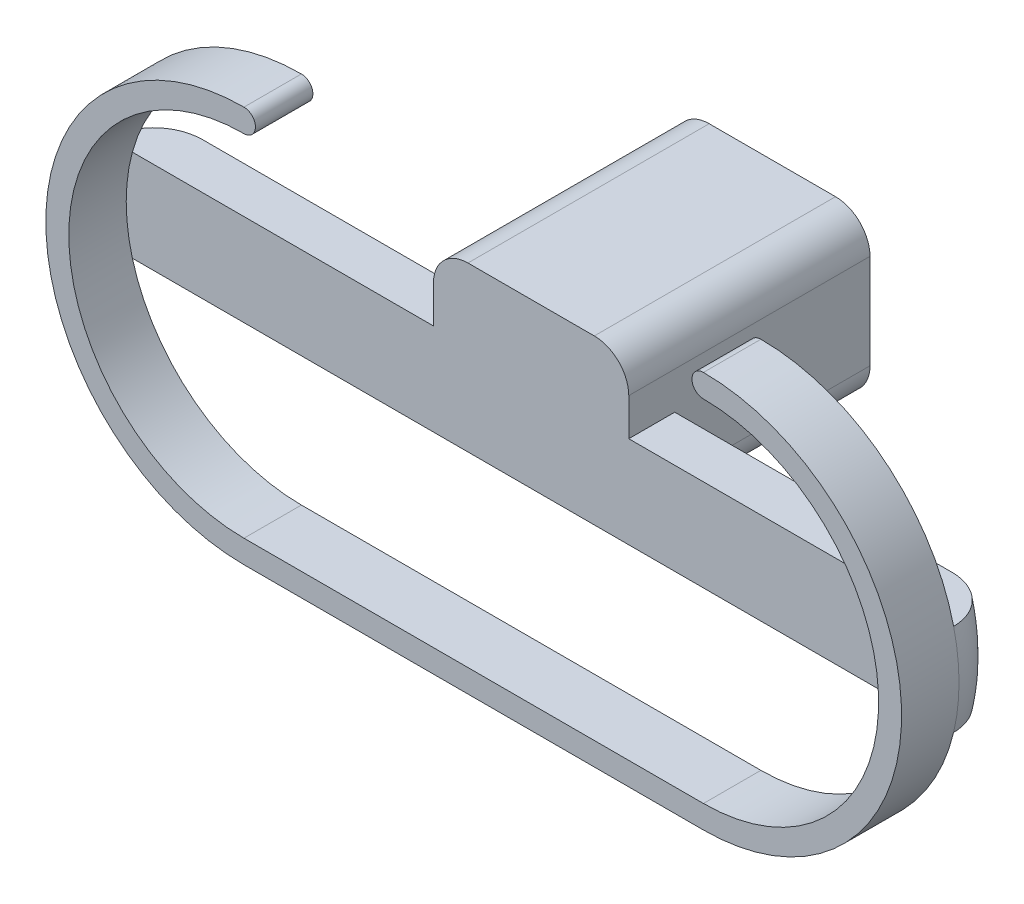
ISO-10303-21;
HEADER;
FILE_DESCRIPTION(('STEP AP214'),'2;1');
FILE_NAME('part.step','',(''),(''),'','','');
FILE_SCHEMA(('AUTOMOTIVE_DESIGN { 1 0 10303 214 1 1 1 1 }'));
ENDSEC;
DATA;
#1=APPLICATION_CONTEXT('core data for automotive mechanical design processes');
#2=APPLICATION_PROTOCOL_DEFINITION('international standard','automotive_design',2000,#1);
#3=PRODUCT_CONTEXT('',#1,'mechanical');
#4=PRODUCT('Part','Part','',(#3));
#5=PRODUCT_RELATED_PRODUCT_CATEGORY('part','',(#4));
#6=PRODUCT_DEFINITION_FORMATION('','',#4);
#7=PRODUCT_DEFINITION_CONTEXT('part definition',#1,'design');
#8=PRODUCT_DEFINITION('design','',#6,#7);
#9=PRODUCT_DEFINITION_SHAPE('','',#8);
#10=(LENGTH_UNIT() NAMED_UNIT(*) SI_UNIT(.MILLI.,.METRE.));
#11=(NAMED_UNIT(*) PLANE_ANGLE_UNIT() SI_UNIT($,.RADIAN.));
#12=(NAMED_UNIT(*) SI_UNIT($,.STERADIAN.) SOLID_ANGLE_UNIT());
#13=UNCERTAINTY_MEASURE_WITH_UNIT(LENGTH_MEASURE(1.E-05),#10,'distance_accuracy_value','');
#14=(GEOMETRIC_REPRESENTATION_CONTEXT(3) GLOBAL_UNCERTAINTY_ASSIGNED_CONTEXT((#13)) GLOBAL_UNIT_ASSIGNED_CONTEXT((#10,
#11,#12)) REPRESENTATION_CONTEXT('',''));
#15=CARTESIAN_POINT('',(0.,0.,0.));
#16=DIRECTION('',(0.,0.,1.));
#17=DIRECTION('',(1.,0.,0.));
#18=AXIS2_PLACEMENT_3D('',#15,#16,#17);
#19=CARTESIAN_POINT('',(20.,0.,-4.));
#20=DIRECTION('',(0.,0.,-1.));
#21=DIRECTION('',(-1.,0.,0.));
#22=AXIS2_PLACEMENT_3D('',#19,#20,#21);
#23=PLANE('',#22);
#24=DIRECTION('',(-1.,0.,0.));
#25=VECTOR('',#24,1.);
#26=CARTESIAN_POINT('',(36.7798241945498,-4.,-4.));
#27=LINE('',#26,#25);
#28=CARTESIAN_POINT('',(32.6318050966598,-4.,-4.));
#29=VERTEX_POINT('',#28);
#30=CARTESIAN_POINT('',(5.5,-4.,-4.));
#31=VERTEX_POINT('',#30);
#32=EDGE_CURVE('E222',#29,#31,#27,.T.);
#33=ORIENTED_EDGE('',*,*,#32,.T.);
#34=CARTESIAN_POINT('',(5.5,-1.,-4.));
#35=DIRECTION('',(0.,0.,-1.));
#36=DIRECTION('',(-1.,0.,0.));
#37=AXIS2_PLACEMENT_3D('',#34,#35,#36);
#38=CIRCLE('',#37,3.);
#39=CARTESIAN_POINT('',(8.5,-0.999999999999996,-4.));
#40=VERTEX_POINT('',#39);
#41=EDGE_CURVE('E11',#31,#40,#38,.F.);
#42=ORIENTED_EDGE('',*,*,#41,.T.);
#43=DIRECTION('',(0.,-1.,0.));
#44=VECTOR('',#43,1.);
#45=CARTESIAN_POINT('',(8.5,10.25,-4.));
#46=LINE('',#45,#44);
#47=CARTESIAN_POINT('',(8.5,4.,-4.));
#48=VERTEX_POINT('',#47);
#49=EDGE_CURVE('E195',#48,#40,#46,.T.);
#50=ORIENTED_EDGE('',*,*,#49,.F.);
#51=DIRECTION('',(1.,0.,0.));
#52=VECTOR('',#51,1.);
#53=CARTESIAN_POINT('',(36.7798241945498,4.,-4.));
#54=LINE('',#53,#52);
#55=CARTESIAN_POINT('',(32.6318050966598,4.,-4.));
#56=VERTEX_POINT('',#55);
#57=EDGE_CURVE('E199',#48,#56,#54,.T.);
#58=ORIENTED_EDGE('',*,*,#57,.T.);
#59=CARTESIAN_POINT('',(20.,0.,-4.));
#60=DIRECTION('',(0.,0.,-1.));
#61=DIRECTION('',(-1.,0.,0.));
#62=AXIS2_PLACEMENT_3D('',#59,#60,#61);
#63=CIRCLE('',#62,13.25);
#64=EDGE_CURVE('E312',#56,#29,#63,.T.);
#65=ORIENTED_EDGE('',*,*,#64,.T.);
#66=EDGE_LOOP('',(#33,#42,#50,#58,#65));
#67=FACE_BOUND('',#66,.T.);
#68=ADVANCED_FACE('F33',(#67),#23,.T.);
#69=CARTESIAN_POINT('',(-32.578631964195,4.,-4.));
#70=VERTEX_POINT('',#69);
#71=CARTESIAN_POINT('',(-8.5,4.,-4.));
#72=VERTEX_POINT('',#71);
#73=EDGE_CURVE('E221',#70,#72,#54,.T.);
#74=ORIENTED_EDGE('',*,*,#73,.T.);
#75=DIRECTION('',(0.,1.,0.));
#76=VECTOR('',#75,1.);
#77=CARTESIAN_POINT('',(-8.5,10.25,-4.));
#78=LINE('',#77,#76);
#79=CARTESIAN_POINT('',(-8.5,-0.999999999999996,-4.));
#80=VERTEX_POINT('',#79);
#81=EDGE_CURVE('E204',#80,#72,#78,.T.);
#82=ORIENTED_EDGE('',*,*,#81,.F.);
#83=CARTESIAN_POINT('',(-5.5,-0.999999999999999,-4.));
#84=DIRECTION('',(0.,0.,-1.));
#85=DIRECTION('',(-1.,0.,0.));
#86=AXIS2_PLACEMENT_3D('',#83,#84,#85);
#87=CIRCLE('',#86,3.);
#88=CARTESIAN_POINT('',(-5.5,-4.,-4.));
#89=VERTEX_POINT('',#88);
#90=EDGE_CURVE('E41',#80,#89,#87,.F.);
#91=ORIENTED_EDGE('',*,*,#90,.T.);
#92=CARTESIAN_POINT('',(-32.578631964195,-4.,-4.));
#93=VERTEX_POINT('',#92);
#94=EDGE_CURVE('E226',#89,#93,#27,.T.);
#95=ORIENTED_EDGE('',*,*,#94,.T.);
#96=CARTESIAN_POINT('',(-22.0637615417868,0.,-4.));
#97=DIRECTION('',(0.,0.,-1.));
#98=DIRECTION('',(-1.,0.,0.));
#99=AXIS2_PLACEMENT_3D('',#96,#97,#98);
#100=CIRCLE('',#99,11.2500000000015);
#101=EDGE_CURVE('E314',#93,#70,#100,.T.);
#102=ORIENTED_EDGE('',*,*,#101,.T.);
#103=EDGE_LOOP('',(#74,#82,#91,#95,#102));
#104=FACE_BOUND('',#103,.T.);
#105=ADVANCED_FACE('F337',(#104),#23,.T.);
#106=CARTESIAN_POINT('',(36.7798241945498,4.,-4.));
#107=DIRECTION('',(0.,-1.,0.));
#108=DIRECTION('',(0.,0.,-1.));
#109=AXIS2_PLACEMENT_3D('',#106,#107,#108);
#110=PLANE('',#109);
#111=DIRECTION('',(0.,0.,1.));
#112=VECTOR('',#111,1.);
#113=CARTESIAN_POINT('',(-8.5,4.,0.));
#114=LINE('',#113,#112);
#115=CARTESIAN_POINT('',(-8.5,4.,0.));
#116=VERTEX_POINT('',#115);
#117=EDGE_CURVE('E214',#72,#116,#114,.T.);
#118=ORIENTED_EDGE('',*,*,#117,.F.);
#119=ORIENTED_EDGE('',*,*,#73,.F.);
#120=CARTESIAN_POINT('',(-32.578631964195,4.,-4.));
#121=CARTESIAN_POINT('',(-32.7021454351701,4.,-4.00001113801036));
#122=CARTESIAN_POINT('',(-32.8256701390243,4.,-3.9950026318222));
#123=CARTESIAN_POINT('',(-33.071922693273,4.,-3.97488649220504));
#124=CARTESIAN_POINT('',(-33.1946503445581,4.,-3.9597764264361));
#125=CARTESIAN_POINT('',(-33.4386254364756,4.,-3.9193647555236));
#126=CARTESIAN_POINT('',(-33.5598701752161,4.,-3.89404677775992));
#127=CARTESIAN_POINT('',(-33.799778267658,4.,-3.83325292107802));
#128=CARTESIAN_POINT('',(-33.9184418469432,4.,-3.79777793371429));
#129=CARTESIAN_POINT('',(-34.1525064102628,4.,-3.71670223837323));
#130=CARTESIAN_POINT('',(-34.2679010258939,4.,-3.67108311788156));
#131=CARTESIAN_POINT('',(-34.4943195606611,4.,-3.56993496340354));
#132=CARTESIAN_POINT('',(-34.605341811772,4.,-3.51440219128682));
#133=CARTESIAN_POINT('',(-34.8218954691761,4.,-3.3938132836302));
#134=CARTESIAN_POINT('',(-34.9274341005734,4.,-3.32877013342386));
#135=CARTESIAN_POINT('',(-35.1323034813199,4.,-3.18947106296168));
#136=CARTESIAN_POINT('',(-35.231632196323,4.,-3.1152121471901));
#137=CARTESIAN_POINT('',(-35.4188795319844,4.,-2.9615000840372));
#138=CARTESIAN_POINT('',(-35.5071093640218,4.,-2.88242585828326));
#139=CARTESIAN_POINT('',(-35.6763036954963,4.,-2.71685520633743));
#140=CARTESIAN_POINT('',(-35.7572685827979,4.,-2.63035917686737));
#141=CARTESIAN_POINT('',(-35.9112662077268,4.,-2.45050271165746));
#142=CARTESIAN_POINT('',(-35.9842953734554,4.,-2.35713921628923));
#143=CARTESIAN_POINT('',(-36.1216998923795,4.,-2.16430119704405));
#144=CARTESIAN_POINT('',(-36.1860788337473,4.,-2.06482923210576));
#145=CARTESIAN_POINT('',(-36.3029342809251,4.,-1.86510472331522));
#146=CARTESIAN_POINT('',(-36.3558163646648,4.,-1.76508927173818));
#147=CARTESIAN_POINT('',(-36.4527172350853,4.,-1.56090254512595));
#148=CARTESIAN_POINT('',(-36.4967398235518,4.,-1.45673307575413));
#149=CARTESIAN_POINT('',(-36.5755386610054,4.,-1.24504601357068));
#150=CARTESIAN_POINT('',(-36.6103221662354,4.,-1.13753112279276));
#151=CARTESIAN_POINT('',(-36.6703767387402,4.,-0.919917975865658));
#152=CARTESIAN_POINT('',(-36.6956511985294,4.,-0.809820655962972));
#153=CARTESIAN_POINT('',(-36.737265295367,4.,-0.583553330597436));
#154=CARTESIAN_POINT('',(-36.7532228658852,4.,-0.467312854256745));
#155=CARTESIAN_POINT('',(-36.7745032223697,4.,-0.234047759977));
#156=CARTESIAN_POINT('',(-36.7798427082465,4.,-0.117024664291766));
#157=CARTESIAN_POINT('',(-36.7798241945498,4.,0.));
#158=B_SPLINE_CURVE_WITH_KNOTS('',3,(#120,#121,#122,#123,#124,#125,#126,#127,#128,#129,#130,
#131,#132,#133,#134,#135,#136,#137,#138,#139,#140,#141,#142,#143,#144,#145,#146,#147,#148,#149,
#150,#151,#152,#153,#154,#155,#156,#157),.UNSPECIFIED.,.F.,.F.,(4,2,2,2,2,2,2,2,2,2,2,2,2,2,2,2,
2,2,4),(0.,0.370455630822242,0.741000495264011,1.11214206145923,1.4832510598462,
1.85503923402637,2.22696789524365,2.59839339219065,2.96993993598865,3.32492977952181,
3.67990065939099,4.03503065693186,4.3900128863264,4.72900139588869,5.0678441270916,
5.40641994389606,5.74487485319247,6.09637933488722,6.44733053876107),.UNSPECIFIED.);
#159=CARTESIAN_POINT('',(-36.7798241945498,4.00000000000012,0.));
#160=VERTEX_POINT('',#159);
#161=EDGE_CURVE('E323',#70,#160,#158,.T.);
#162=ORIENTED_EDGE('',*,*,#161,.T.);
#163=DIRECTION('',(1.,0.,0.));
#164=VECTOR('',#163,1.);
#165=CARTESIAN_POINT('',(36.7798241945498,4.,0.));
#166=LINE('',#165,#164);
#167=CARTESIAN_POINT('',(-34.7160626527614,4.,0.));
#168=VERTEX_POINT('',#167);
#169=EDGE_CURVE('E239',#160,#168,#166,.T.);
#170=ORIENTED_EDGE('',*,*,#169,.T.);
#171=EDGE_CURVE('E242',#168,#116,#166,.T.);
#172=ORIENTED_EDGE('',*,*,#171,.T.);
#173=EDGE_LOOP('',(#118,#119,#162,#170,#172));
#174=FACE_BOUND('',#173,.T.);
#175=ADVANCED_FACE('F332',(#174),#110,.F.);
#176=DIRECTION('',(0.,0.,-1.));
#177=VECTOR('',#176,1.);
#178=CARTESIAN_POINT('',(8.5,4.,0.));
#179=LINE('',#178,#177);
#180=CARTESIAN_POINT('',(8.5,4.,0.));
#181=VERTEX_POINT('',#180);
#182=EDGE_CURVE('E208',#181,#48,#179,.T.);
#183=ORIENTED_EDGE('',*,*,#182,.F.);
#184=CARTESIAN_POINT('',(34.7160626527614,4.,0.));
#185=VERTEX_POINT('',#184);
#186=EDGE_CURVE('E238',#181,#185,#166,.T.);
#187=ORIENTED_EDGE('',*,*,#186,.T.);
#188=CARTESIAN_POINT('',(36.7798241945498,4.,0.));
#189=VERTEX_POINT('',#188);
#190=EDGE_CURVE('E243',#185,#189,#166,.T.);
#191=ORIENTED_EDGE('',*,*,#190,.T.);
#192=CARTESIAN_POINT('',(36.7798241945498,4.,0.));
#193=CARTESIAN_POINT('',(36.7798375918073,4.,-0.110119852217719));
#194=CARTESIAN_POINT('',(36.7751499228688,4.,-0.220236918363126));
#195=CARTESIAN_POINT('',(36.7564701734707,4.,-0.439669359077596));
#196=CARTESIAN_POINT('',(36.7424789389513,4.,-0.5489848056215));
#197=CARTESIAN_POINT('',(36.7053158057075,4.,-0.765886102197835));
#198=CARTESIAN_POINT('',(36.6821568006623,4.,-0.873474161464435));
#199=CARTESIAN_POINT('',(36.6268495267485,4.,-1.08631112394843));
#200=CARTESIAN_POINT('',(36.5947012965558,4.,-1.19156003722779));
#201=CARTESIAN_POINT('',(36.5216610378987,4.,-1.39899466082808));
#202=CARTESIAN_POINT('',(36.480768354203,4.,-1.50118014094804));
#203=CARTESIAN_POINT('',(36.3905706292768,4.,-1.70178100660745));
#204=CARTESIAN_POINT('',(36.3412624892186,4.,-1.80019498696014));
#205=CARTESIAN_POINT('',(36.1812896442056,4.,-2.08867095159642));
#206=CARTESIAN_POINT('',(36.0584979396663,4.,-2.27218894943267));
#207=CARTESIAN_POINT('',(35.783151364913,4.,-2.61814296761635));
#208=CARTESIAN_POINT('',(35.6303144304826,4.,-2.7803527927236));
#209=CARTESIAN_POINT('',(35.3001616468699,4.,-3.07762857261295));
#210=CARTESIAN_POINT('',(35.1228419635511,4.,-3.21269026769278));
#211=CARTESIAN_POINT('',(34.7439512424201,4.,-3.45564114908037));
#212=CARTESIAN_POINT('',(34.5418692954744,4.,-3.56273199770005));
#213=CARTESIAN_POINT('',(34.1230085176364,4.,-3.7427775512139));
#214=CARTESIAN_POINT('',(33.9062284965279,4.,-3.81572948782864));
#215=CARTESIAN_POINT('',(33.5129283221899,4.,-3.91401160713189));
#216=CARTESIAN_POINT('',(33.3381053646277,4.,-3.9463050522993));
#217=CARTESIAN_POINT('',(32.9861276507483,4.,-3.9893000337904));
#218=CARTESIAN_POINT('',(32.8089774682811,4.,-4.00003894892021));
#219=CARTESIAN_POINT('',(32.6318050966598,4.,-4.));
#220=B_SPLINE_CURVE_WITH_KNOTS('',3,(#192,#193,#194,#195,#196,#197,#198,#199,#200,#201,#202,
#203,#204,#205,#206,#207,#208,#209,#210,#211,#212,#213,#214,#215,#216,#217,#218,#219),
.UNSPECIFIED.,.F.,.F.,(4,2,2,2,2,2,2,2,2,2,2,2,2,4),(0.,0.330255618154406,0.660481211445299,
0.990244011595252,1.32000539297753,1.64979149240294,1.97969929217737,2.63881721673562,
3.30444699439562,3.97018113191923,4.65323507860986,5.33634440365219,5.8684020948541,
6.39953631782262),.UNSPECIFIED.);
#221=EDGE_CURVE('E219',#189,#56,#220,.T.);
#222=ORIENTED_EDGE('',*,*,#221,.T.);
#223=ORIENTED_EDGE('',*,*,#57,.F.);
#224=EDGE_LOOP('',(#183,#187,#191,#222,#223));
#225=FACE_BOUND('',#224,.T.);
#226=ADVANCED_FACE('F216',(#225),#110,.F.);
#227=CARTESIAN_POINT('',(-20.,16.25,0.));
#228=DIRECTION('',(0.,0.,1.));
#229=DIRECTION('',(1.,0.,0.));
#230=AXIS2_PLACEMENT_3D('',#227,#228,#229);
#231=PLANE('',#230);
#232=ORIENTED_EDGE('',*,*,#169,.F.);
#233=CARTESIAN_POINT('',(-20.,0.,0.));
#234=DIRECTION('',(0.,0.,1.));
#235=DIRECTION('',(1.,0.,0.));
#236=AXIS2_PLACEMENT_3D('',#233,#234,#235);
#237=CIRCLE('',#236,17.25);
#238=CARTESIAN_POINT('',(-20.,17.25,0.));
#239=VERTEX_POINT('',#238);
#240=EDGE_CURVE('E266',#239,#160,#237,.T.);
#241=ORIENTED_EDGE('',*,*,#240,.F.);
#242=CARTESIAN_POINT('',(-20.,16.25,0.));
#243=DIRECTION('',(0.,0.,1.));
#244=DIRECTION('',(1.,0.,0.));
#245=AXIS2_PLACEMENT_3D('',#242,#243,#244);
#246=CIRCLE('',#245,1.);
#247=CARTESIAN_POINT('',(-20.,15.25,0.));
#248=VERTEX_POINT('',#247);
#249=EDGE_CURVE('E225',#248,#239,#246,.T.);
#250=ORIENTED_EDGE('',*,*,#249,.F.);
#251=CARTESIAN_POINT('',(-20.,0.,0.));
#252=DIRECTION('',(0.,0.,-1.));
#253=DIRECTION('',(1.,0.,0.));
#254=AXIS2_PLACEMENT_3D('',#251,#252,#253);
#255=CIRCLE('',#254,15.25);
#256=EDGE_CURVE('E285',#168,#248,#255,.T.);
#257=ORIENTED_EDGE('',*,*,#256,.F.);
#258=EDGE_LOOP('',(#232,#241,#250,#257));
#259=FACE_BOUND('',#258,.T.);
#260=ADVANCED_FACE('F402',(#259),#231,.F.);
#261=ORIENTED_EDGE('',*,*,#190,.F.);
#262=CARTESIAN_POINT('',(20.,0.,0.));
#263=DIRECTION('',(0.,0.,-1.));
#264=DIRECTION('',(1.,0.,0.));
#265=AXIS2_PLACEMENT_3D('',#262,#263,#264);
#266=CIRCLE('',#265,15.25);
#267=CARTESIAN_POINT('',(20.,15.25,0.));
#268=VERTEX_POINT('',#267);
#269=EDGE_CURVE('E279',#268,#185,#266,.T.);
#270=ORIENTED_EDGE('',*,*,#269,.F.);
#271=CARTESIAN_POINT('',(20.,16.25,0.));
#272=DIRECTION('',(0.,0.,1.));
#273=DIRECTION('',(-1.,0.,0.));
#274=AXIS2_PLACEMENT_3D('',#271,#272,#273);
#275=CIRCLE('',#274,1.);
#276=CARTESIAN_POINT('',(20.,17.25,0.));
#277=VERTEX_POINT('',#276);
#278=EDGE_CURVE('E276',#277,#268,#275,.T.);
#279=ORIENTED_EDGE('',*,*,#278,.F.);
#280=CARTESIAN_POINT('',(20.,0.,0.));
#281=DIRECTION('',(0.,0.,1.));
#282=DIRECTION('',(-1.,0.,0.));
#283=AXIS2_PLACEMENT_3D('',#280,#281,#282);
#284=CIRCLE('',#283,17.25);
#285=EDGE_CURVE('E272',#189,#277,#284,.T.);
#286=ORIENTED_EDGE('',*,*,#285,.F.);
#287=EDGE_LOOP('',(#261,#270,#279,#286));
#288=FACE_BOUND('',#287,.T.);
#289=ADVANCED_FACE('F404',(#288),#231,.F.);
#290=DIRECTION('',(-1.,0.,0.));
#291=VECTOR('',#290,1.);
#292=CARTESIAN_POINT('',(36.7798241945498,-4.,0.));
#293=LINE('',#292,#291);
#294=CARTESIAN_POINT('',(36.7798241945498,-4.,0.));
#295=VERTEX_POINT('',#294);
#296=CARTESIAN_POINT('',(34.7160626527614,-4.,0.));
#297=VERTEX_POINT('',#296);
#298=EDGE_CURVE('E230',#295,#297,#293,.T.);
#299=ORIENTED_EDGE('',*,*,#298,.F.);
#300=CARTESIAN_POINT('',(20.,-17.25,0.));
#301=VERTEX_POINT('',#300);
#302=EDGE_CURVE('E273',#301,#295,#284,.T.);
#303=ORIENTED_EDGE('',*,*,#302,.F.);
#304=DIRECTION('',(1.,0.,0.));
#305=VECTOR('',#304,1.);
#306=CARTESIAN_POINT('',(-20.,-17.25,0.));
#307=LINE('',#306,#305);
#308=CARTESIAN_POINT('',(-20.,-17.25,0.));
#309=VERTEX_POINT('',#308);
#310=EDGE_CURVE('E269',#309,#301,#307,.T.);
#311=ORIENTED_EDGE('',*,*,#310,.F.);
#312=CARTESIAN_POINT('',(-36.7798241945498,-3.99999999999999,0.));
#313=VERTEX_POINT('',#312);
#314=EDGE_CURVE('E265',#313,#309,#237,.T.);
#315=ORIENTED_EDGE('',*,*,#314,.F.);
#316=CARTESIAN_POINT('',(-34.7160626527614,-4.,0.));
#317=VERTEX_POINT('',#316);
#318=EDGE_CURVE('E235',#317,#313,#293,.T.);
#319=ORIENTED_EDGE('',*,*,#318,.F.);
#320=CARTESIAN_POINT('',(-20.,-15.25,0.));
#321=VERTEX_POINT('',#320);
#322=EDGE_CURVE('E248',#321,#317,#255,.T.);
#323=ORIENTED_EDGE('',*,*,#322,.F.);
#324=DIRECTION('',(-1.,0.,0.));
#325=VECTOR('',#324,1.);
#326=CARTESIAN_POINT('',(-20.,-15.25,0.));
#327=LINE('',#326,#325);
#328=CARTESIAN_POINT('',(20.,-15.25,0.));
#329=VERTEX_POINT('',#328);
#330=EDGE_CURVE('E282',#329,#321,#327,.T.);
#331=ORIENTED_EDGE('',*,*,#330,.F.);
#332=EDGE_CURVE('E278',#297,#329,#266,.T.);
#333=ORIENTED_EDGE('',*,*,#332,.F.);
#334=EDGE_LOOP('',(#299,#303,#311,#315,#319,#323,#331,#333));
#335=FACE_BOUND('',#334,.T.);
#336=ADVANCED_FACE('F374',(#335),#231,.F.);
#337=CARTESIAN_POINT('',(-20.,16.25,5.));
#338=DIRECTION('',(0.,0.,-1.));
#339=DIRECTION('',(-1.,0.,0.));
#340=AXIS2_PLACEMENT_3D('',#337,#338,#339);
#341=CYLINDRICAL_SURFACE('',#340,1.);
#342=ORIENTED_EDGE('',*,*,#249,.T.);
#343=DIRECTION('',(0.,0.,-1.));
#344=VECTOR('',#343,1.);
#345=CARTESIAN_POINT('',(-20.,17.25,5.));
#346=LINE('',#345,#344);
#347=CARTESIAN_POINT('',(-20.,17.25,5.));
#348=VERTEX_POINT('',#347);
#349=EDGE_CURVE('E309',#348,#239,#346,.T.);
#350=ORIENTED_EDGE('',*,*,#349,.F.);
#351=CARTESIAN_POINT('',(-20.,16.25,5.));
#352=DIRECTION('',(0.,0.,1.));
#353=DIRECTION('',(1.,0.,0.));
#354=AXIS2_PLACEMENT_3D('',#351,#352,#353);
#355=CIRCLE('',#354,1.);
#356=CARTESIAN_POINT('',(-20.,15.25,5.));
#357=VERTEX_POINT('',#356);
#358=EDGE_CURVE('E244',#357,#348,#355,.T.);
#359=ORIENTED_EDGE('',*,*,#358,.F.);
#360=DIRECTION('',(0.,0.,-1.));
#361=VECTOR('',#360,1.);
#362=CARTESIAN_POINT('',(-20.,15.25,5.));
#363=LINE('',#362,#361);
#364=EDGE_CURVE('E262',#357,#248,#363,.T.);
#365=ORIENTED_EDGE('',*,*,#364,.T.);
#366=EDGE_LOOP('',(#342,#350,#359,#365));
#367=FACE_BOUND('',#366,.T.);
#368=ADVANCED_FACE('F369',(#367),#341,.T.);
#369=CARTESIAN_POINT('',(-20.,0.,5.));
#370=DIRECTION('',(0.,0.,-1.));
#371=DIRECTION('',(-1.,0.,0.));
#372=AXIS2_PLACEMENT_3D('',#369,#370,#371);
#373=CYLINDRICAL_SURFACE('',#372,17.25);
#374=ORIENTED_EDGE('',*,*,#240,.T.);
#375=EDGE_CURVE('E270',#160,#313,#237,.T.);
#376=ORIENTED_EDGE('',*,*,#375,.T.);
#377=ORIENTED_EDGE('',*,*,#314,.T.);
#378=DIRECTION('',(0.,0.,-1.));
#379=VECTOR('',#378,1.);
#380=CARTESIAN_POINT('',(-20.,-17.25,5.));
#381=LINE('',#380,#379);
#382=CARTESIAN_POINT('',(-20.,-17.25,5.));
#383=VERTEX_POINT('',#382);
#384=EDGE_CURVE('E306',#383,#309,#381,.T.);
#385=ORIENTED_EDGE('',*,*,#384,.F.);
#386=CARTESIAN_POINT('',(-20.,0.,5.));
#387=DIRECTION('',(0.,0.,1.));
#388=DIRECTION('',(1.,0.,0.));
#389=AXIS2_PLACEMENT_3D('',#386,#387,#388);
#390=CIRCLE('',#389,17.25);
#391=EDGE_CURVE('E247',#348,#383,#390,.T.);
#392=ORIENTED_EDGE('',*,*,#391,.F.);
#393=ORIENTED_EDGE('',*,*,#349,.T.);
#394=EDGE_LOOP('',(#374,#376,#377,#385,#392,#393));
#395=FACE_BOUND('',#394,.T.);
#396=ADVANCED_FACE('F373',(#395),#373,.T.);
#397=CARTESIAN_POINT('',(-20.,-17.25,5.));
#398=DIRECTION('',(0.,1.,0.));
#399=DIRECTION('',(0.,0.,1.));
#400=AXIS2_PLACEMENT_3D('',#397,#398,#399);
#401=PLANE('',#400);
#402=ORIENTED_EDGE('',*,*,#310,.T.);
#403=DIRECTION('',(0.,0.,-1.));
#404=VECTOR('',#403,1.);
#405=CARTESIAN_POINT('',(20.,-17.25,5.));
#406=LINE('',#405,#404);
#407=CARTESIAN_POINT('',(20.,-17.25,5.));
#408=VERTEX_POINT('',#407);
#409=EDGE_CURVE('E303',#408,#301,#406,.T.);
#410=ORIENTED_EDGE('',*,*,#409,.F.);
#411=DIRECTION('',(1.,0.,0.));
#412=VECTOR('',#411,1.);
#413=CARTESIAN_POINT('',(-20.,-17.25,5.));
#414=LINE('',#413,#412);
#415=EDGE_CURVE('E250',#383,#408,#414,.T.);
#416=ORIENTED_EDGE('',*,*,#415,.F.);
#417=ORIENTED_EDGE('',*,*,#384,.T.);
#418=EDGE_LOOP('',(#402,#410,#416,#417));
#419=FACE_BOUND('',#418,.T.);
#420=ADVANCED_FACE('F378',(#419),#401,.F.);
#421=CARTESIAN_POINT('',(20.,0.,5.));
#422=DIRECTION('',(0.,0.,-1.));
#423=DIRECTION('',(-1.,0.,0.));
#424=AXIS2_PLACEMENT_3D('',#421,#422,#423);
#425=CYLINDRICAL_SURFACE('',#424,17.25);
#426=ORIENTED_EDGE('',*,*,#302,.T.);
#427=CARTESIAN_POINT('',(20.,0.,0.));
#428=DIRECTION('',(0.,0.,-1.));
#429=DIRECTION('',(-1.,0.,0.));
#430=AXIS2_PLACEMENT_3D('',#427,#428,#429);
#431=CIRCLE('',#430,17.25);
#432=EDGE_CURVE('E362',#295,#189,#431,.F.);
#433=ORIENTED_EDGE('',*,*,#432,.T.);
#434=ORIENTED_EDGE('',*,*,#285,.T.);
#435=DIRECTION('',(0.,0.,-1.));
#436=VECTOR('',#435,1.);
#437=CARTESIAN_POINT('',(20.,17.25,5.));
#438=LINE('',#437,#436);
#439=CARTESIAN_POINT('',(20.,17.25,5.));
#440=VERTEX_POINT('',#439);
#441=EDGE_CURVE('E300',#440,#277,#438,.T.);
#442=ORIENTED_EDGE('',*,*,#441,.F.);
#443=CARTESIAN_POINT('',(20.,0.,5.));
#444=DIRECTION('',(0.,0.,1.));
#445=DIRECTION('',(-1.,0.,0.));
#446=AXIS2_PLACEMENT_3D('',#443,#444,#445);
#447=CIRCLE('',#446,17.25);
#448=EDGE_CURVE('E252',#408,#440,#447,.T.);
#449=ORIENTED_EDGE('',*,*,#448,.F.);
#450=ORIENTED_EDGE('',*,*,#409,.T.);
#451=EDGE_LOOP('',(#426,#433,#434,#442,#449,#450));
#452=FACE_BOUND('',#451,.T.);
#453=ADVANCED_FACE('F382',(#452),#425,.T.);
#454=CARTESIAN_POINT('',(20.,16.25,5.));
#455=DIRECTION('',(0.,0.,-1.));
#456=DIRECTION('',(-1.,0.,0.));
#457=AXIS2_PLACEMENT_3D('',#454,#455,#456);
#458=CYLINDRICAL_SURFACE('',#457,1.);
#459=ORIENTED_EDGE('',*,*,#278,.T.);
#460=DIRECTION('',(0.,0.,-1.));
#461=VECTOR('',#460,1.);
#462=CARTESIAN_POINT('',(20.,15.25,5.));
#463=LINE('',#462,#461);
#464=CARTESIAN_POINT('',(20.,15.25,5.));
#465=VERTEX_POINT('',#464);
#466=EDGE_CURVE('E297',#465,#268,#463,.T.);
#467=ORIENTED_EDGE('',*,*,#466,.F.);
#468=CARTESIAN_POINT('',(20.,16.25,5.));
#469=DIRECTION('',(0.,0.,1.));
#470=DIRECTION('',(-1.,0.,0.));
#471=AXIS2_PLACEMENT_3D('',#468,#469,#470);
#472=CIRCLE('',#471,1.);
#473=EDGE_CURVE('E254',#440,#465,#472,.T.);
#474=ORIENTED_EDGE('',*,*,#473,.F.);
#475=ORIENTED_EDGE('',*,*,#441,.T.);
#476=EDGE_LOOP('',(#459,#467,#474,#475));
#477=FACE_BOUND('',#476,.T.);
#478=ADVANCED_FACE('F386',(#477),#458,.T.);
#479=CARTESIAN_POINT('',(20.,0.,5.));
#480=DIRECTION('',(0.,0.,-1.));
#481=DIRECTION('',(-1.,0.,0.));
#482=AXIS2_PLACEMENT_3D('',#479,#480,#481);
#483=CYLINDRICAL_SURFACE('',#482,15.25);
#484=ORIENTED_EDGE('',*,*,#269,.T.);
#485=EDGE_CURVE('E283',#185,#297,#266,.T.);
#486=ORIENTED_EDGE('',*,*,#485,.T.);
#487=ORIENTED_EDGE('',*,*,#332,.T.);
#488=DIRECTION('',(0.,0.,-1.));
#489=VECTOR('',#488,1.);
#490=CARTESIAN_POINT('',(20.,-15.25,5.));
#491=LINE('',#490,#489);
#492=CARTESIAN_POINT('',(20.,-15.25,5.));
#493=VERTEX_POINT('',#492);
#494=EDGE_CURVE('E294',#493,#329,#491,.T.);
#495=ORIENTED_EDGE('',*,*,#494,.F.);
#496=CARTESIAN_POINT('',(20.,0.,5.));
#497=DIRECTION('',(0.,0.,-1.));
#498=DIRECTION('',(1.,0.,0.));
#499=AXIS2_PLACEMENT_3D('',#496,#497,#498);
#500=CIRCLE('',#499,15.25);
#501=EDGE_CURVE('E256',#465,#493,#500,.T.);
#502=ORIENTED_EDGE('',*,*,#501,.F.);
#503=ORIENTED_EDGE('',*,*,#466,.T.);
#504=EDGE_LOOP('',(#484,#486,#487,#495,#502,#503));
#505=FACE_BOUND('',#504,.T.);
#506=ADVANCED_FACE('F390',(#505),#483,.F.);
#507=CARTESIAN_POINT('',(-20.,-15.25,5.));
#508=DIRECTION('',(0.,-1.,0.));
#509=DIRECTION('',(0.,0.,-1.));
#510=AXIS2_PLACEMENT_3D('',#507,#508,#509);
#511=PLANE('',#510);
#512=ORIENTED_EDGE('',*,*,#330,.T.);
#513=DIRECTION('',(0.,0.,-1.));
#514=VECTOR('',#513,1.);
#515=CARTESIAN_POINT('',(-20.,-15.25,5.));
#516=LINE('',#515,#514);
#517=CARTESIAN_POINT('',(-20.,-15.25,5.));
#518=VERTEX_POINT('',#517);
#519=EDGE_CURVE('E291',#518,#321,#516,.T.);
#520=ORIENTED_EDGE('',*,*,#519,.F.);
#521=DIRECTION('',(-1.,0.,0.));
#522=VECTOR('',#521,1.);
#523=CARTESIAN_POINT('',(-20.,-15.25,5.));
#524=LINE('',#523,#522);
#525=EDGE_CURVE('E258',#493,#518,#524,.T.);
#526=ORIENTED_EDGE('',*,*,#525,.F.);
#527=ORIENTED_EDGE('',*,*,#494,.T.);
#528=EDGE_LOOP('',(#512,#520,#526,#527));
#529=FACE_BOUND('',#528,.T.);
#530=ADVANCED_FACE('F394',(#529),#511,.F.);
#531=CARTESIAN_POINT('',(-20.,0.,5.));
#532=DIRECTION('',(0.,0.,-1.));
#533=DIRECTION('',(-1.,0.,0.));
#534=AXIS2_PLACEMENT_3D('',#531,#532,#533);
#535=CYLINDRICAL_SURFACE('',#534,15.25);
#536=ORIENTED_EDGE('',*,*,#322,.T.);
#537=EDGE_CURVE('E288',#317,#168,#255,.T.);
#538=ORIENTED_EDGE('',*,*,#537,.T.);
#539=ORIENTED_EDGE('',*,*,#256,.T.);
#540=ORIENTED_EDGE('',*,*,#364,.F.);
#541=CARTESIAN_POINT('',(-20.,0.,5.));
#542=DIRECTION('',(0.,0.,-1.));
#543=DIRECTION('',(1.,0.,0.));
#544=AXIS2_PLACEMENT_3D('',#541,#542,#543);
#545=CIRCLE('',#544,15.25);
#546=EDGE_CURVE('E260',#518,#357,#545,.T.);
#547=ORIENTED_EDGE('',*,*,#546,.F.);
#548=ORIENTED_EDGE('',*,*,#519,.T.);
#549=EDGE_LOOP('',(#536,#538,#539,#540,#547,#548));
#550=FACE_BOUND('',#549,.T.);
#551=ADVANCED_FACE('F398',(#550),#535,.F.);
#552=CARTESIAN_POINT('',(-20.,16.25,5.));
#553=DIRECTION('',(0.,0.,1.));
#554=DIRECTION('',(1.,0.,0.));
#555=AXIS2_PLACEMENT_3D('',#552,#553,#554);
#556=PLANE('',#555);
#557=ORIENTED_EDGE('',*,*,#358,.T.);
#558=ORIENTED_EDGE('',*,*,#391,.T.);
#559=ORIENTED_EDGE('',*,*,#415,.T.);
#560=ORIENTED_EDGE('',*,*,#448,.T.);
#561=ORIENTED_EDGE('',*,*,#473,.T.);
#562=ORIENTED_EDGE('',*,*,#501,.T.);
#563=ORIENTED_EDGE('',*,*,#525,.T.);
#564=ORIENTED_EDGE('',*,*,#546,.T.);
#565=EDGE_LOOP('',(#557,#558,#559,#560,#561,#562,#563,#564));
#566=FACE_BOUND('',#565,.T.);
#567=ADVANCED_FACE('F348',(#566),#556,.T.);
#568=CARTESIAN_POINT('',(20.,0.,0.));
#569=DIRECTION('',(0.,0.,-1.));
#570=DIRECTION('',(-1.,0.,0.));
#571=AXIS2_PLACEMENT_3D('',#568,#569,#570);
#572=PLANE('',#571);
#573=DIRECTION('',(1.,0.,0.));
#574=VECTOR('',#573,1.);
#575=CARTESIAN_POINT('',(-8.5,10.25,0.));
#576=LINE('',#575,#574);
#577=CARTESIAN_POINT('',(-5.5,10.25,0.));
#578=VERTEX_POINT('',#577);
#579=CARTESIAN_POINT('',(5.5,10.25,0.));
#580=VERTEX_POINT('',#579);
#581=EDGE_CURVE('E213',#578,#580,#576,.T.);
#582=ORIENTED_EDGE('',*,*,#581,.F.);
#583=CARTESIAN_POINT('',(-5.5,7.25,0.));
#584=DIRECTION('',(0.,0.,-1.));
#585=DIRECTION('',(-1.,0.,0.));
#586=AXIS2_PLACEMENT_3D('',#583,#584,#585);
#587=CIRCLE('',#586,3.);
#588=CARTESIAN_POINT('',(-8.5,7.25,0.));
#589=VERTEX_POINT('',#588);
#590=EDGE_CURVE('E56',#578,#589,#587,.F.);
#591=ORIENTED_EDGE('',*,*,#590,.T.);
#592=DIRECTION('',(0.,-1.,0.));
#593=VECTOR('',#592,1.);
#594=CARTESIAN_POINT('',(-8.5,10.25,0.));
#595=LINE('',#594,#593);
#596=EDGE_CURVE('E486',#589,#116,#595,.T.);
#597=ORIENTED_EDGE('',*,*,#596,.T.);
#598=ORIENTED_EDGE('',*,*,#171,.F.);
#599=ORIENTED_EDGE('',*,*,#537,.F.);
#600=EDGE_CURVE('E234',#297,#317,#293,.T.);
#601=ORIENTED_EDGE('',*,*,#600,.F.);
#602=ORIENTED_EDGE('',*,*,#485,.F.);
#603=ORIENTED_EDGE('',*,*,#186,.F.);
#604=DIRECTION('',(0.,-1.,0.));
#605=VECTOR('',#604,1.);
#606=CARTESIAN_POINT('',(8.5,10.25,0.));
#607=LINE('',#606,#605);
#608=CARTESIAN_POINT('',(8.5,7.25,0.));
#609=VERTEX_POINT('',#608);
#610=EDGE_CURVE('E210',#609,#181,#607,.T.);
#611=ORIENTED_EDGE('',*,*,#610,.F.);
#612=CARTESIAN_POINT('',(5.5,7.25,0.));
#613=DIRECTION('',(0.,0.,-1.));
#614=DIRECTION('',(-1.,0.,0.));
#615=AXIS2_PLACEMENT_3D('',#612,#613,#614);
#616=CIRCLE('',#615,3.);
#617=EDGE_CURVE('E48',#609,#580,#616,.F.);
#618=ORIENTED_EDGE('',*,*,#617,.T.);
#619=EDGE_LOOP('',(#582,#591,#597,#598,#599,#601,#602,#603,#611,#618));
#620=FACE_BOUND('',#619,.T.);
#621=ADVANCED_FACE('F346',(#620),#572,.F.);
#622=CARTESIAN_POINT('',(36.7798241945498,-4.,-4.));
#623=DIRECTION('',(0.,1.,0.));
#624=DIRECTION('',(0.,0.,1.));
#625=AXIS2_PLACEMENT_3D('',#622,#623,#624);
#626=PLANE('',#625);
#627=ORIENTED_EDGE('',*,*,#94,.F.);
#628=DIRECTION('',(0.,0.,1.));
#629=VECTOR('',#628,1.);
#630=CARTESIAN_POINT('',(-5.5,-4.,-4.));
#631=LINE('',#630,#629);
#632=CARTESIAN_POINT('',(-5.5,-4.,-21.));
#633=VERTEX_POINT('',#632);
#634=EDGE_CURVE('E536',#89,#633,#631,.F.);
#635=ORIENTED_EDGE('',*,*,#634,.T.);
#636=DIRECTION('',(-1.,0.,0.));
#637=VECTOR('',#636,1.);
#638=CARTESIAN_POINT('',(8.5,-4.,-21.));
#639=LINE('',#638,#637);
#640=CARTESIAN_POINT('',(5.5,-4.,-21.));
#641=VERTEX_POINT('',#640);
#642=EDGE_CURVE('E473',#641,#633,#639,.T.);
#643=ORIENTED_EDGE('',*,*,#642,.F.);
#644=DIRECTION('',(0.,0.,1.));
#645=VECTOR('',#644,1.);
#646=CARTESIAN_POINT('',(5.5,-4.,-4.));
#647=LINE('',#646,#645);
#648=EDGE_CURVE('E531',#641,#31,#647,.T.);
#649=ORIENTED_EDGE('',*,*,#648,.T.);
#650=ORIENTED_EDGE('',*,*,#32,.F.);
#651=CARTESIAN_POINT('',(32.6318050966598,-4.,-4.));
#652=CARTESIAN_POINT('',(32.7522223789699,-4.,-4.00001085996657));
#653=CARTESIAN_POINT('',(32.872645949643,-4.,-3.99505827438392));
#654=CARTESIAN_POINT('',(33.1126888366891,-4.,-3.97522295100857));
#655=CARTESIAN_POINT('',(33.232308035689,-4.,-3.96033879446357));
#656=CARTESIAN_POINT('',(33.4699942044125,-4.,-3.92061972732124));
#657=CARTESIAN_POINT('',(33.5880597272922,-4.,-3.895776137777));
#658=CARTESIAN_POINT('',(33.8216702128078,-4.,-3.8362216502465));
#659=CARTESIAN_POINT('',(33.9372153287859,-4.,-3.80151135436629));
#660=CARTESIAN_POINT('',(34.1650802682009,-4.,-3.72232126730534));
#661=CARTESIAN_POINT('',(34.2773956863994,-4.,-3.67782878754006));
#662=CARTESIAN_POINT('',(34.4978192337524,-4.,-3.57931216657987));
#663=CARTESIAN_POINT('',(34.6059257750682,-4.,-3.52528446986042));
#664=CARTESIAN_POINT('',(34.8169133760642,-4.,-3.40808463496512));
#665=CARTESIAN_POINT('',(34.9197999418162,-4.,-3.34492241474364));
#666=CARTESIAN_POINT('',(35.119666152277,-4.,-3.20978270801462));
#667=CARTESIAN_POINT('',(35.2166438170927,-4.,-3.1378022908555));
#668=CARTESIAN_POINT('',(35.4010113159138,-4.,-2.98782687599689));
#669=CARTESIAN_POINT('',(35.488602167893,-4.,-2.91007892614746));
#670=CARTESIAN_POINT('',(35.6567128161496,-4.,-2.74728263508828));
#671=CARTESIAN_POINT('',(35.7372328835164,-4.,-2.66223457400767));
#672=CARTESIAN_POINT('',(35.8905681734895,-4.,-2.48539072054489));
#673=CARTESIAN_POINT('',(35.9633801540965,-4.,-2.3935921161954));
#674=CARTESIAN_POINT('',(36.1006163797221,-4.,-2.20397787992008));
#675=CARTESIAN_POINT('',(36.1650439605765,-4.,-2.10616466392991));
#676=CARTESIAN_POINT('',(36.2829663009434,-4.,-1.90860604527708));
#677=CARTESIAN_POINT('',(36.336756240017,-4.,-1.80903673060402));
#678=CARTESIAN_POINT('',(36.4355559685939,-4.,-1.60568189283312));
#679=CARTESIAN_POINT('',(36.4805693846887,-4.,-1.50189813271921));
#680=CARTESIAN_POINT('',(36.5614425729909,-4.,-1.290900130928));
#681=CARTESIAN_POINT('',(36.5973083502505,-4.,-1.18368819200845));
#682=CARTESIAN_POINT('',(36.6596160229739,-4.,-0.966600273856441));
#683=CARTESIAN_POINT('',(36.6860609968609,-4.,-0.856725177417997));
#684=CARTESIAN_POINT('',(36.731665127817,-4.,-0.623039547299905));
#685=CARTESIAN_POINT('',(36.7497203748569,-4.,-0.499012081870004));
#686=CARTESIAN_POINT('',(36.7738026121008,-4.,-0.249987760451938));
#687=CARTESIAN_POINT('',(36.779847998827,-4.,-0.124992681974038));
#688=CARTESIAN_POINT('',(36.7798241945498,-4.,0.));
#689=B_SPLINE_CURVE_WITH_KNOTS('',3,(#651,#652,#653,#654,#655,#656,#657,#658,#659,#660,#661,
#662,#663,#664,#665,#666,#667,#668,#669,#670,#671,#672,#673,#674,#675,#676,#677,#678,#679,#680,
#681,#682,#683,#684,#685,#686,#687,#688),.UNSPECIFIED.,.F.,.F.,(4,2,2,2,2,2,2,2,2,2,2,2,2,2,2,2,
2,2,4),(0.,0.36115950692221,0.722370617525206,1.08389718488623,1.44540169517867,
1.80737791304467,2.16948939212924,2.5312106142876,2.89305237916168,3.24397495720575,
3.59488407521774,3.94594020307453,4.29685622914613,4.63595100414661,4.97490536173575,
5.31363663355032,5.65225711685247,6.02767203648579,6.40251145646333),.UNSPECIFIED.);
#690=EDGE_CURVE('E351',#29,#295,#689,.T.);
#691=ORIENTED_EDGE('',*,*,#690,.T.);
#692=ORIENTED_EDGE('',*,*,#298,.T.);
#693=ORIENTED_EDGE('',*,*,#600,.T.);
#694=ORIENTED_EDGE('',*,*,#318,.T.);
#695=CARTESIAN_POINT('',(-36.7798241945498,-3.99999999999999,0.));
#696=CARTESIAN_POINT('',(-36.7798379027375,-4.,-0.109414703377978));
#697=CARTESIAN_POINT('',(-36.7751725273744,-4.,-0.218826431835063));
#698=CARTESIAN_POINT('',(-36.7565836753349,-4.,-0.436849881058871));
#699=CARTESIAN_POINT('',(-36.7426611351104,-4.,-0.545461681622506));
#700=CARTESIAN_POINT('',(-36.705686891337,-4.,-0.760945183906035));
#701=CARTESIAN_POINT('',(-36.6826494865474,-4.,-0.867819339433706));
#702=CARTESIAN_POINT('',(-36.6276408783414,-4.,-1.07924007126074));
#703=CARTESIAN_POINT('',(-36.5956696969952,-4.,-1.18378665330947));
#704=CARTESIAN_POINT('',(-36.5230461885203,-4.,-1.38982885455222));
#705=CARTESIAN_POINT('',(-36.4823936811935,-4.,-1.49132441036622));
#706=CARTESIAN_POINT('',(-36.3927433710027,-4.,-1.69057307732973));
#707=CARTESIAN_POINT('',(-36.3437424948363,-4.,-1.78832479396201));
#708=CARTESIAN_POINT('',(-36.1847967552823,-4.,-2.07488111568484));
#709=CARTESIAN_POINT('',(-36.0628343912066,-4.,-2.25719672978553));
#710=CARTESIAN_POINT('',(-35.7891671729493,-4.,-2.60141673646175));
#711=CARTESIAN_POINT('',(-35.6371172652516,-4.,-2.76304465300666));
#712=CARTESIAN_POINT('',(-35.3087964034017,-4.,-3.05948638635436));
#713=CARTESIAN_POINT('',(-35.1325225417728,-4.,-3.19429697965065));
#714=CARTESIAN_POINT('',(-34.754672897215,-4.,-3.43814893785691));
#715=CARTESIAN_POINT('',(-34.5524531132109,-4.,-3.54619057023715));
#716=CARTESIAN_POINT('',(-34.1333000231762,-4.,-3.72853964758663));
#717=CARTESIAN_POINT('',(-33.9163618843981,-4.,-3.80283595011533));
#718=CARTESIAN_POINT('',(-33.5126969144686,-4.,-3.90666806595944));
#719=CARTESIAN_POINT('',(-33.3273864690882,-4.,-3.94178583282639));
#720=CARTESIAN_POINT('',(-33.0474909889899,-4.,-3.9767810732772));
#721=CARTESIAN_POINT('',(-32.9539402652978,-4.,-3.98549932271032));
#722=CARTESIAN_POINT('',(-32.766476384606,-4.,-3.9971089405007));
#723=CARTESIAN_POINT('',(-32.6725632241065,-4.,-4.00000025245053));
#724=CARTESIAN_POINT('',(-32.578631964195,-4.,-4.));
#725=B_SPLINE_CURVE_WITH_KNOTS('',3,(#695,#696,#697,#698,#699,#700,#701,#702,#703,#704,#705,
#706,#707,#708,#709,#710,#711,#712,#713,#714,#715,#716,#717,#718,#719,#720,#721,#722,#723,#724),
.UNSPECIFIED.,.F.,.F.,(4,2,2,2,2,2,2,2,2,2,2,2,2,2,4),(0.,0.328140180986281,0.656247172466076,
0.98384148064097,1.3114349795318,1.63903527893786,1.9667564401471,2.62153914067032,
3.28431870402144,3.94717788698774,4.63195996205781,5.3169679826596,5.88121152660333,
6.16291985905002,6.44463091854891),.UNSPECIFIED.);
#726=EDGE_CURVE('E356',#313,#93,#725,.T.);
#727=ORIENTED_EDGE('',*,*,#726,.T.);
#728=EDGE_LOOP('',(#627,#635,#643,#649,#650,#691,#692,#693,#694,#727));
#729=FACE_BOUND('',#728,.T.);
#730=ADVANCED_FACE('F341',(#729),#626,.F.);
#731=ORIENTED_EDGE('',*,*,#375,.F.);
#732=CARTESIAN_POINT('',(-22.0637615417868,0.,0.));
#733=DIRECTION('',(0.,0.,-1.));
#734=DIRECTION('',(1.,0.,0.));
#735=AXIS2_PLACEMENT_3D('',#732,#733,#734);
#736=CIRCLE('',#735,15.2500000000015);
#737=EDGE_CURVE('E233',#313,#160,#736,.T.);
#738=ORIENTED_EDGE('',*,*,#737,.F.);
#739=EDGE_LOOP('',(#731,#738));
#740=FACE_BOUND('',#739,.T.);
#741=ADVANCED_FACE('F339',(#740),#572,.F.);
#742=CARTESIAN_POINT('',(-22.0637615417868,0.,0.));
#743=DIRECTION('',(0.,0.,-1.));
#744=DIRECTION('',(-1.,0.,0.));
#745=AXIS2_PLACEMENT_3D('',#742,#743,#744);
#746=TOROIDAL_SURFACE('',#745,11.2500000000015,4.);
#747=ORIENTED_EDGE('',*,*,#726,.F.);
#748=ORIENTED_EDGE('',*,*,#737,.T.);
#749=ORIENTED_EDGE('',*,*,#161,.F.);
#750=ORIENTED_EDGE('',*,*,#101,.F.);
#751=EDGE_LOOP('',(#747,#748,#749,#750));
#752=FACE_BOUND('',#751,.T.);
#753=ADVANCED_FACE('F364',(#752),#746,.T.);
#754=CARTESIAN_POINT('',(20.,0.,0.));
#755=DIRECTION('',(0.,0.,-1.));
#756=DIRECTION('',(-1.,0.,0.));
#757=AXIS2_PLACEMENT_3D('',#754,#755,#756);
#758=TOROIDAL_SURFACE('',#757,13.25,4.);
#759=ORIENTED_EDGE('',*,*,#221,.F.);
#760=ORIENTED_EDGE('',*,*,#432,.F.);
#761=ORIENTED_EDGE('',*,*,#690,.F.);
#762=ORIENTED_EDGE('',*,*,#64,.F.);
#763=EDGE_LOOP('',(#759,#760,#761,#762));
#764=FACE_BOUND('',#763,.T.);
#765=ADVANCED_FACE('F329',(#764),#758,.T.);
#766=CARTESIAN_POINT('',(-8.5,10.25,0.));
#767=DIRECTION('',(1.,0.,0.));
#768=DIRECTION('',(0.,0.,-1.));
#769=AXIS2_PLACEMENT_3D('',#766,#767,#768);
#770=PLANE('',#769);
#771=DIRECTION('',(0.,1.,0.));
#772=VECTOR('',#771,1.);
#773=CARTESIAN_POINT('',(-8.5,10.25,-21.));
#774=LINE('',#773,#772);
#775=CARTESIAN_POINT('',(-8.5,-0.999999999999996,-21.));
#776=VERTEX_POINT('',#775);
#777=CARTESIAN_POINT('',(-8.5,7.25,-21.));
#778=VERTEX_POINT('',#777);
#779=EDGE_CURVE('E476',#776,#778,#774,.T.);
#780=ORIENTED_EDGE('',*,*,#779,.F.);
#781=DIRECTION('',(0.,0.,1.));
#782=VECTOR('',#781,1.);
#783=CARTESIAN_POINT('',(-8.5,-0.999999999999999,0.));
#784=LINE('',#783,#782);
#785=EDGE_CURVE('E528',#776,#80,#784,.T.);
#786=ORIENTED_EDGE('',*,*,#785,.T.);
#787=ORIENTED_EDGE('',*,*,#81,.T.);
#788=ORIENTED_EDGE('',*,*,#117,.T.);
#789=ORIENTED_EDGE('',*,*,#596,.F.);
#790=DIRECTION('',(0.,0.,1.));
#791=VECTOR('',#790,1.);
#792=CARTESIAN_POINT('',(-8.5,7.25,0.));
#793=LINE('',#792,#791);
#794=EDGE_CURVE('E527',#589,#778,#793,.F.);
#795=ORIENTED_EDGE('',*,*,#794,.T.);
#796=EDGE_LOOP('',(#780,#786,#787,#788,#789,#795));
#797=FACE_BOUND('',#796,.T.);
#798=ADVANCED_FACE('F421',(#797),#770,.F.);
#799=CARTESIAN_POINT('',(8.5,10.25,0.));
#800=DIRECTION('',(-1.,0.,0.));
#801=DIRECTION('',(0.,0.,1.));
#802=AXIS2_PLACEMENT_3D('',#799,#800,#801);
#803=PLANE('',#802);
#804=ORIENTED_EDGE('',*,*,#49,.T.);
#805=DIRECTION('',(0.,0.,1.));
#806=VECTOR('',#805,1.);
#807=CARTESIAN_POINT('',(8.5,-0.999999999999999,0.));
#808=LINE('',#807,#806);
#809=CARTESIAN_POINT('',(8.5,-0.999999999999996,-21.));
#810=VERTEX_POINT('',#809);
#811=EDGE_CURVE('E548',#40,#810,#808,.F.);
#812=ORIENTED_EDGE('',*,*,#811,.T.);
#813=DIRECTION('',(0.,-1.,0.));
#814=VECTOR('',#813,1.);
#815=CARTESIAN_POINT('',(8.5,10.25,-21.));
#816=LINE('',#815,#814);
#817=CARTESIAN_POINT('',(8.5,7.25,-21.));
#818=VERTEX_POINT('',#817);
#819=EDGE_CURVE('E470',#818,#810,#816,.T.);
#820=ORIENTED_EDGE('',*,*,#819,.F.);
#821=DIRECTION('',(0.,0.,-1.));
#822=VECTOR('',#821,1.);
#823=CARTESIAN_POINT('',(8.5,7.25,0.));
#824=LINE('',#823,#822);
#825=EDGE_CURVE('E546',#818,#609,#824,.F.);
#826=ORIENTED_EDGE('',*,*,#825,.T.);
#827=ORIENTED_EDGE('',*,*,#610,.T.);
#828=ORIENTED_EDGE('',*,*,#182,.T.);
#829=EDGE_LOOP('',(#804,#812,#820,#826,#827,#828));
#830=FACE_BOUND('',#829,.T.);
#831=ADVANCED_FACE('F209',(#830),#803,.F.);
#832=CARTESIAN_POINT('',(0.,10.25,0.));
#833=DIRECTION('',(0.,-1.,0.));
#834=DIRECTION('',(0.,0.,-1.));
#835=AXIS2_PLACEMENT_3D('',#832,#833,#834);
#836=PLANE('',#835);
#837=DIRECTION('',(1.,0.,0.));
#838=VECTOR('',#837,1.);
#839=CARTESIAN_POINT('',(8.5,10.25,-21.));
#840=LINE('',#839,#838);
#841=CARTESIAN_POINT('',(-5.5,10.25,-21.));
#842=VERTEX_POINT('',#841);
#843=CARTESIAN_POINT('',(5.5,10.25,-21.));
#844=VERTEX_POINT('',#843);
#845=EDGE_CURVE('E479',#842,#844,#840,.T.);
#846=ORIENTED_EDGE('',*,*,#845,.F.);
#847=DIRECTION('',(0.,0.,1.));
#848=VECTOR('',#847,1.);
#849=CARTESIAN_POINT('',(-5.5,10.25,0.));
#850=LINE('',#849,#848);
#851=EDGE_CURVE('E553',#842,#578,#850,.T.);
#852=ORIENTED_EDGE('',*,*,#851,.T.);
#853=ORIENTED_EDGE('',*,*,#581,.T.);
#854=DIRECTION('',(0.,0.,-1.));
#855=VECTOR('',#854,1.);
#856=CARTESIAN_POINT('',(5.5,10.25,0.));
#857=LINE('',#856,#855);
#858=EDGE_CURVE('E550',#580,#844,#857,.T.);
#859=ORIENTED_EDGE('',*,*,#858,.T.);
#860=EDGE_LOOP('',(#846,#852,#853,#859));
#861=FACE_BOUND('',#860,.T.);
#862=ADVANCED_FACE('F427',(#861),#836,.F.);
#863=CARTESIAN_POINT('',(0.,0.,-21.));
#864=DIRECTION('',(0.,0.,-1.));
#865=DIRECTION('',(-1.,0.,0.));
#866=AXIS2_PLACEMENT_3D('',#863,#864,#865);
#867=PLANE('',#866);
#868=CARTESIAN_POINT('',(-5.5,7.125,-21.));
#869=DIRECTION('',(0.,0.,-1.));
#870=DIRECTION('',(-1.,0.,0.));
#871=AXIS2_PLACEMENT_3D('',#868,#869,#870);
#872=CIRCLE('',#871,1.5);
#873=CARTESIAN_POINT('',(-7.,7.125,-21.));
#874=VERTEX_POINT('',#873);
#875=EDGE_CURVE('E460',#874,#874,#872,.T.);
#876=ORIENTED_EDGE('',*,*,#875,.F.);
#877=EDGE_LOOP('',(#876));
#878=FACE_BOUND('',#877,.T.);
#879=CARTESIAN_POINT('',(5.5,7.125,-21.));
#880=DIRECTION('',(0.,0.,-1.));
#881=DIRECTION('',(-1.,0.,0.));
#882=AXIS2_PLACEMENT_3D('',#879,#880,#881);
#883=CIRCLE('',#882,1.5);
#884=CARTESIAN_POINT('',(4.,7.125,-21.));
#885=VERTEX_POINT('',#884);
#886=EDGE_CURVE('E205',#885,#885,#883,.T.);
#887=ORIENTED_EDGE('',*,*,#886,.F.);
#888=EDGE_LOOP('',(#887));
#889=FACE_BOUND('',#888,.T.);
#890=ORIENTED_EDGE('',*,*,#642,.T.);
#891=CARTESIAN_POINT('',(-5.5,-0.999999999999999,-21.));
#892=DIRECTION('',(0.,0.,-1.));
#893=DIRECTION('',(-1.,0.,0.));
#894=AXIS2_PLACEMENT_3D('',#891,#892,#893);
#895=CIRCLE('',#894,3.);
#896=EDGE_CURVE('E544',#633,#776,#895,.T.);
#897=ORIENTED_EDGE('',*,*,#896,.T.);
#898=ORIENTED_EDGE('',*,*,#779,.T.);
#899=CARTESIAN_POINT('',(-5.5,7.25,-21.));
#900=DIRECTION('',(0.,0.,-1.));
#901=DIRECTION('',(-1.,0.,0.));
#902=AXIS2_PLACEMENT_3D('',#899,#900,#901);
#903=CIRCLE('',#902,3.);
#904=EDGE_CURVE('E540',#778,#842,#903,.T.);
#905=ORIENTED_EDGE('',*,*,#904,.T.);
#906=ORIENTED_EDGE('',*,*,#845,.T.);
#907=CARTESIAN_POINT('',(5.5,7.25,-21.));
#908=DIRECTION('',(0.,0.,-1.));
#909=DIRECTION('',(-1.,0.,0.));
#910=AXIS2_PLACEMENT_3D('',#907,#908,#909);
#911=CIRCLE('',#910,3.);
#912=EDGE_CURVE('E538',#844,#818,#911,.T.);
#913=ORIENTED_EDGE('',*,*,#912,.T.);
#914=ORIENTED_EDGE('',*,*,#819,.T.);
#915=CARTESIAN_POINT('',(5.5,-1.,-21.));
#916=DIRECTION('',(0.,0.,-1.));
#917=DIRECTION('',(-1.,0.,0.));
#918=AXIS2_PLACEMENT_3D('',#915,#916,#917);
#919=CIRCLE('',#918,3.);
#920=EDGE_CURVE('E542',#810,#641,#919,.T.);
#921=ORIENTED_EDGE('',*,*,#920,.T.);
#922=EDGE_LOOP('',(#890,#897,#898,#905,#906,#913,#914,#921));
#923=FACE_BOUND('',#922,.T.);
#924=ADVANCED_FACE('F430',(#878,#889,#923),#867,.T.);
#925=CARTESIAN_POINT('',(5.5,7.125,-21.));
#926=DIRECTION('',(0.,0.,1.));
#927=DIRECTION('',(1.,0.,0.));
#928=AXIS2_PLACEMENT_3D('',#925,#926,#927);
#929=CYLINDRICAL_SURFACE('',#928,1.5);
#930=ORIENTED_EDGE('',*,*,#886,.T.);
#931=EDGE_LOOP('',(#930));
#932=FACE_BOUND('',#931,.T.);
#933=CARTESIAN_POINT('',(5.5,7.125,-4.));
#934=DIRECTION('',(0.,0.,-1.));
#935=DIRECTION('',(-1.,0.,0.));
#936=AXIS2_PLACEMENT_3D('',#933,#934,#935);
#937=CIRCLE('',#936,1.5);
#938=CARTESIAN_POINT('',(4.,7.125,-4.));
#939=VERTEX_POINT('',#938);
#940=EDGE_CURVE('E463',#939,#939,#937,.T.);
#941=ORIENTED_EDGE('',*,*,#940,.F.);
#942=EDGE_LOOP('',(#941));
#943=FACE_BOUND('',#942,.T.);
#944=ADVANCED_FACE('F434',(#932,#943),#929,.F.);
#945=CARTESIAN_POINT('',(5.5,7.125,-4.));
#946=DIRECTION('',(0.,0.,-1.));
#947=DIRECTION('',(-1.,0.,0.));
#948=AXIS2_PLACEMENT_3D('',#945,#946,#947);
#949=PLANE('',#948);
#950=ORIENTED_EDGE('',*,*,#940,.T.);
#951=EDGE_LOOP('',(#950));
#952=FACE_BOUND('',#951,.T.);
#953=ADVANCED_FACE('F438',(#952),#949,.T.);
#954=CARTESIAN_POINT('',(-5.5,7.125,-21.));
#955=DIRECTION('',(0.,0.,1.));
#956=DIRECTION('',(1.,0.,0.));
#957=AXIS2_PLACEMENT_3D('',#954,#955,#956);
#958=CYLINDRICAL_SURFACE('',#957,1.5);
#959=ORIENTED_EDGE('',*,*,#875,.T.);
#960=EDGE_LOOP('',(#959));
#961=FACE_BOUND('',#960,.T.);
#962=CARTESIAN_POINT('',(-5.5,7.125,-4.));
#963=DIRECTION('',(0.,0.,-1.));
#964=DIRECTION('',(-1.,0.,0.));
#965=AXIS2_PLACEMENT_3D('',#962,#963,#964);
#966=CIRCLE('',#965,1.5);
#967=CARTESIAN_POINT('',(-7.,7.125,-4.));
#968=VERTEX_POINT('',#967);
#969=EDGE_CURVE('E458',#968,#968,#966,.T.);
#970=ORIENTED_EDGE('',*,*,#969,.F.);
#971=EDGE_LOOP('',(#970));
#972=FACE_BOUND('',#971,.T.);
#973=ADVANCED_FACE('F442',(#961,#972),#958,.F.);
#974=CARTESIAN_POINT('',(-5.5,7.125,-4.));
#975=DIRECTION('',(0.,0.,-1.));
#976=DIRECTION('',(-1.,0.,0.));
#977=AXIS2_PLACEMENT_3D('',#974,#975,#976);
#978=PLANE('',#977);
#979=ORIENTED_EDGE('',*,*,#969,.T.);
#980=EDGE_LOOP('',(#979));
#981=FACE_BOUND('',#980,.T.);
#982=ADVANCED_FACE('F446',(#981),#978,.T.);
#983=CARTESIAN_POINT('',(-5.5,-0.999999999999999,0.));
#984=DIRECTION('',(0.,0.,1.));
#985=DIRECTION('',(1.,0.,0.));
#986=AXIS2_PLACEMENT_3D('',#983,#984,#985);
#987=CYLINDRICAL_SURFACE('',#986,3.);
#988=ORIENTED_EDGE('',*,*,#896,.F.);
#989=ORIENTED_EDGE('',*,*,#634,.F.);
#990=ORIENTED_EDGE('',*,*,#90,.F.);
#991=ORIENTED_EDGE('',*,*,#785,.F.);
#992=EDGE_LOOP('',(#988,#989,#990,#991));
#993=FACE_BOUND('',#992,.T.);
#994=ADVANCED_FACE('F449',(#993),#987,.T.);
#995=CARTESIAN_POINT('',(5.5,-1.,-4.));
#996=DIRECTION('',(0.,0.,1.));
#997=DIRECTION('',(1.,0.,0.));
#998=AXIS2_PLACEMENT_3D('',#995,#996,#997);
#999=CYLINDRICAL_SURFACE('',#998,3.);
#1000=ORIENTED_EDGE('',*,*,#920,.F.);
#1001=ORIENTED_EDGE('',*,*,#811,.F.);
#1002=ORIENTED_EDGE('',*,*,#41,.F.);
#1003=ORIENTED_EDGE('',*,*,#648,.F.);
#1004=EDGE_LOOP('',(#1000,#1001,#1002,#1003));
#1005=FACE_BOUND('',#1004,.T.);
#1006=ADVANCED_FACE('F454',(#1005),#999,.T.);
#1007=CARTESIAN_POINT('',(-5.5,7.25,0.));
#1008=DIRECTION('',(0.,0.,1.));
#1009=DIRECTION('',(1.,0.,0.));
#1010=AXIS2_PLACEMENT_3D('',#1007,#1008,#1009);
#1011=CYLINDRICAL_SURFACE('',#1010,3.);
#1012=ORIENTED_EDGE('',*,*,#904,.F.);
#1013=ORIENTED_EDGE('',*,*,#794,.F.);
#1014=ORIENTED_EDGE('',*,*,#590,.F.);
#1015=ORIENTED_EDGE('',*,*,#851,.F.);
#1016=EDGE_LOOP('',(#1012,#1013,#1014,#1015));
#1017=FACE_BOUND('',#1016,.T.);
#1018=ADVANCED_FACE('F709',(#1017),#1011,.T.);
#1019=CARTESIAN_POINT('',(5.5,7.25,0.));
#1020=DIRECTION('',(0.,0.,-1.));
#1021=DIRECTION('',(-1.,0.,0.));
#1022=AXIS2_PLACEMENT_3D('',#1019,#1020,#1021);
#1023=CYLINDRICAL_SURFACE('',#1022,3.);
#1024=ORIENTED_EDGE('',*,*,#617,.F.);
#1025=ORIENTED_EDGE('',*,*,#825,.F.);
#1026=ORIENTED_EDGE('',*,*,#912,.F.);
#1027=ORIENTED_EDGE('',*,*,#858,.F.);
#1028=EDGE_LOOP('',(#1024,#1025,#1026,#1027));
#1029=FACE_BOUND('',#1028,.T.);
#1030=ADVANCED_FACE('F35',(#1029),#1023,.T.);
#1031=CLOSED_SHELL('',(#68,#105,#175,#226,#260,#289,#336,#368,#396,#420,#453,#478,#506,#530,
#551,#567,#621,#730,#741,#753,#765,#798,#831,#862,#924,#944,#953,#973,#982,#994,#1006,#1018,#1030));
#1032=MANIFOLD_SOLID_BREP('B2',#1031);
#1033=ADVANCED_BREP_SHAPE_REPRESENTATION('',(#18,#1032),#14);
#1034=SHAPE_DEFINITION_REPRESENTATION(#9,#1033);
ENDSEC;
END-ISO-10303-21;
